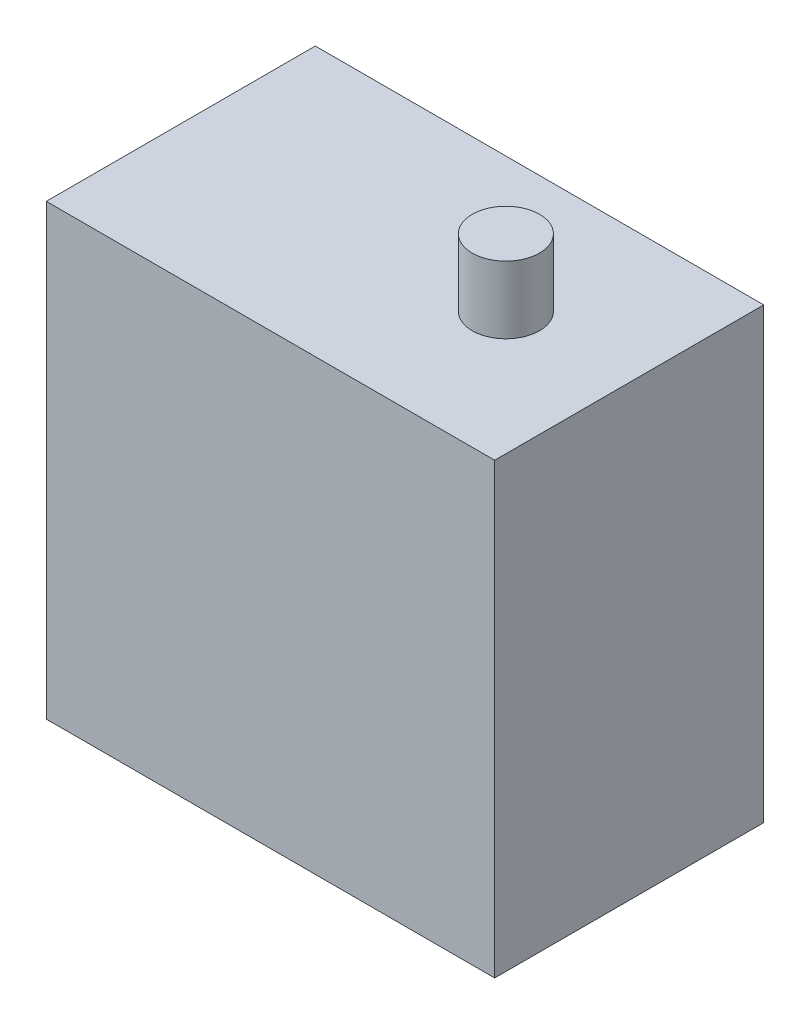
ISO-10303-21;
HEADER;
FILE_DESCRIPTION(('STEP AP214'),'2;1');
FILE_NAME('part.step','',(''),(''),'','','');
FILE_SCHEMA(('AUTOMOTIVE_DESIGN { 1 0 10303 214 1 1 1 1 }'));
ENDSEC;
DATA;
#1=APPLICATION_CONTEXT('core data for automotive mechanical design processes');
#2=APPLICATION_PROTOCOL_DEFINITION('international standard','automotive_design',2000,#1);
#3=PRODUCT_CONTEXT('',#1,'mechanical');
#4=PRODUCT('Part','Part','',(#3));
#5=PRODUCT_RELATED_PRODUCT_CATEGORY('part','',(#4));
#6=PRODUCT_DEFINITION_FORMATION('','',#4);
#7=PRODUCT_DEFINITION_CONTEXT('part definition',#1,'design');
#8=PRODUCT_DEFINITION('design','',#6,#7);
#9=PRODUCT_DEFINITION_SHAPE('','',#8);
#10=(LENGTH_UNIT() NAMED_UNIT(*) SI_UNIT(.MILLI.,.METRE.));
#11=(NAMED_UNIT(*) PLANE_ANGLE_UNIT() SI_UNIT($,.RADIAN.));
#12=(NAMED_UNIT(*) SI_UNIT($,.STERADIAN.) SOLID_ANGLE_UNIT());
#13=UNCERTAINTY_MEASURE_WITH_UNIT(LENGTH_MEASURE(1.E-05),#10,'distance_accuracy_value','');
#14=(GEOMETRIC_REPRESENTATION_CONTEXT(3) GLOBAL_UNCERTAINTY_ASSIGNED_CONTEXT((#13)) GLOBAL_UNIT_ASSIGNED_CONTEXT((#10,
#11,#12)) REPRESENTATION_CONTEXT('',''));
#15=CARTESIAN_POINT('',(0.,0.,0.));
#16=DIRECTION('',(0.,0.,1.));
#17=DIRECTION('',(1.,0.,0.));
#18=AXIS2_PLACEMENT_3D('',#15,#16,#17);
#19=CARTESIAN_POINT('',(10.,20.,-6.));
#20=DIRECTION('',(-1.,0.,0.));
#21=DIRECTION('',(0.,0.,1.));
#22=AXIS2_PLACEMENT_3D('',#19,#20,#21);
#23=PLANE('',#22);
#24=DIRECTION('',(0.,0.,-1.));
#25=VECTOR('',#24,1.);
#26=CARTESIAN_POINT('',(10.,0.,-6.));
#27=LINE('',#26,#25);
#28=CARTESIAN_POINT('',(10.,0.,6.));
#29=VERTEX_POINT('',#28);
#30=CARTESIAN_POINT('',(10.,0.,-6.));
#31=VERTEX_POINT('',#30);
#32=EDGE_CURVE('E96',#29,#31,#27,.T.);
#33=ORIENTED_EDGE('',*,*,#32,.T.);
#34=DIRECTION('',(0.,-1.,0.));
#35=VECTOR('',#34,1.);
#36=CARTESIAN_POINT('',(10.,20.,-6.));
#37=LINE('',#36,#35);
#38=CARTESIAN_POINT('',(10.,20.,-6.));
#39=VERTEX_POINT('',#38);
#40=EDGE_CURVE('E11',#39,#31,#37,.T.);
#41=ORIENTED_EDGE('',*,*,#40,.F.);
#42=DIRECTION('',(0.,0.,-1.));
#43=VECTOR('',#42,1.);
#44=CARTESIAN_POINT('',(10.,20.,-6.));
#45=LINE('',#44,#43);
#46=CARTESIAN_POINT('',(10.,20.,6.));
#47=VERTEX_POINT('',#46);
#48=EDGE_CURVE('E84',#47,#39,#45,.T.);
#49=ORIENTED_EDGE('',*,*,#48,.F.);
#50=DIRECTION('',(0.,-1.,0.));
#51=VECTOR('',#50,1.);
#52=CARTESIAN_POINT('',(10.,20.,6.));
#53=LINE('',#52,#51);
#54=EDGE_CURVE('E92',#47,#29,#53,.T.);
#55=ORIENTED_EDGE('',*,*,#54,.T.);
#56=EDGE_LOOP('',(#33,#41,#49,#55));
#57=FACE_BOUND('',#56,.T.);
#58=ADVANCED_FACE('F33',(#57),#23,.F.);
#59=CARTESIAN_POINT('',(-10.,20.,-6.));
#60=DIRECTION('',(0.,0.,1.));
#61=DIRECTION('',(1.,0.,0.));
#62=AXIS2_PLACEMENT_3D('',#59,#60,#61);
#63=PLANE('',#62);
#64=DIRECTION('',(-1.,0.,0.));
#65=VECTOR('',#64,1.);
#66=CARTESIAN_POINT('',(-10.,0.,-6.));
#67=LINE('',#66,#65);
#68=CARTESIAN_POINT('',(-10.,0.,-6.));
#69=VERTEX_POINT('',#68);
#70=EDGE_CURVE('E88',#31,#69,#67,.T.);
#71=ORIENTED_EDGE('',*,*,#70,.T.);
#72=DIRECTION('',(0.,-1.,0.));
#73=VECTOR('',#72,1.);
#74=CARTESIAN_POINT('',(-10.,20.,-6.));
#75=LINE('',#74,#73);
#76=CARTESIAN_POINT('',(-10.,20.,-6.));
#77=VERTEX_POINT('',#76);
#78=EDGE_CURVE('E41',#77,#69,#75,.T.);
#79=ORIENTED_EDGE('',*,*,#78,.F.);
#80=DIRECTION('',(-1.,0.,0.));
#81=VECTOR('',#80,1.);
#82=CARTESIAN_POINT('',(-10.,20.,-6.));
#83=LINE('',#82,#81);
#84=EDGE_CURVE('E79',#39,#77,#83,.T.);
#85=ORIENTED_EDGE('',*,*,#84,.F.);
#86=ORIENTED_EDGE('',*,*,#40,.T.);
#87=EDGE_LOOP('',(#71,#79,#85,#86));
#88=FACE_BOUND('',#87,.T.);
#89=ADVANCED_FACE('F87',(#88),#63,.F.);
#90=CARTESIAN_POINT('',(-10.,20.,-6.));
#91=DIRECTION('',(1.,0.,0.));
#92=DIRECTION('',(0.,0.,-1.));
#93=AXIS2_PLACEMENT_3D('',#90,#91,#92);
#94=PLANE('',#93);
#95=DIRECTION('',(0.,0.,1.));
#96=VECTOR('',#95,1.);
#97=CARTESIAN_POINT('',(-10.,0.,-6.));
#98=LINE('',#97,#96);
#99=CARTESIAN_POINT('',(-10.,0.,6.));
#100=VERTEX_POINT('',#99);
#101=EDGE_CURVE('E66',#69,#100,#98,.T.);
#102=ORIENTED_EDGE('',*,*,#101,.T.);
#103=DIRECTION('',(0.,-1.,0.));
#104=VECTOR('',#103,1.);
#105=CARTESIAN_POINT('',(-10.,20.,6.));
#106=LINE('',#105,#104);
#107=CARTESIAN_POINT('',(-10.,20.,6.));
#108=VERTEX_POINT('',#107);
#109=EDGE_CURVE('E89',#108,#100,#106,.T.);
#110=ORIENTED_EDGE('',*,*,#109,.F.);
#111=DIRECTION('',(0.,0.,1.));
#112=VECTOR('',#111,1.);
#113=CARTESIAN_POINT('',(-10.,20.,-6.));
#114=LINE('',#113,#112);
#115=EDGE_CURVE('E82',#77,#108,#114,.T.);
#116=ORIENTED_EDGE('',*,*,#115,.F.);
#117=ORIENTED_EDGE('',*,*,#78,.T.);
#118=EDGE_LOOP('',(#102,#110,#116,#117));
#119=FACE_BOUND('',#118,.T.);
#120=ADVANCED_FACE('F90',(#119),#94,.F.);
#121=CARTESIAN_POINT('',(-10.,20.,6.));
#122=DIRECTION('',(0.,0.,-1.));
#123=DIRECTION('',(-1.,0.,0.));
#124=AXIS2_PLACEMENT_3D('',#121,#122,#123);
#125=PLANE('',#124);
#126=DIRECTION('',(1.,0.,0.));
#127=VECTOR('',#126,1.);
#128=CARTESIAN_POINT('',(-10.,0.,6.));
#129=LINE('',#128,#127);
#130=EDGE_CURVE('E72',#100,#29,#129,.T.);
#131=ORIENTED_EDGE('',*,*,#130,.T.);
#132=ORIENTED_EDGE('',*,*,#54,.F.);
#133=DIRECTION('',(1.,0.,0.));
#134=VECTOR('',#133,1.);
#135=CARTESIAN_POINT('',(-10.,20.,6.));
#136=LINE('',#135,#134);
#137=EDGE_CURVE('E49',#108,#47,#136,.T.);
#138=ORIENTED_EDGE('',*,*,#137,.F.);
#139=ORIENTED_EDGE('',*,*,#109,.T.);
#140=EDGE_LOOP('',(#131,#132,#138,#139));
#141=FACE_BOUND('',#140,.T.);
#142=ADVANCED_FACE('F104',(#141),#125,.F.);
#143=CARTESIAN_POINT('',(0.,20.,0.));
#144=DIRECTION('',(0.,1.,0.));
#145=DIRECTION('',(0.,0.,1.));
#146=AXIS2_PLACEMENT_3D('',#143,#144,#145);
#147=PLANE('',#146);
#148=CARTESIAN_POINT('',(4.5,20.,0.));
#149=DIRECTION('',(0.,1.,0.));
#150=DIRECTION('',(0.,0.,1.));
#151=AXIS2_PLACEMENT_3D('',#148,#149,#150);
#152=CIRCLE('',#151,1.5);
#153=CARTESIAN_POINT('',(4.5,20.,1.5));
#154=VERTEX_POINT('',#153);
#155=EDGE_CURVE('E110',#154,#154,#152,.T.);
#156=ORIENTED_EDGE('',*,*,#155,.F.);
#157=EDGE_LOOP('',(#156));
#158=FACE_BOUND('',#157,.T.);
#159=ORIENTED_EDGE('',*,*,#48,.T.);
#160=ORIENTED_EDGE('',*,*,#84,.T.);
#161=ORIENTED_EDGE('',*,*,#115,.T.);
#162=ORIENTED_EDGE('',*,*,#137,.T.);
#163=EDGE_LOOP('',(#159,#160,#161,#162));
#164=FACE_BOUND('',#163,.T.);
#165=ADVANCED_FACE('F80',(#158,#164),#147,.T.);
#166=CARTESIAN_POINT('',(0.,0.,0.));
#167=DIRECTION('',(0.,1.,0.));
#168=DIRECTION('',(0.,0.,1.));
#169=AXIS2_PLACEMENT_3D('',#166,#167,#168);
#170=PLANE('',#169);
#171=ORIENTED_EDGE('',*,*,#32,.F.);
#172=ORIENTED_EDGE('',*,*,#130,.F.);
#173=ORIENTED_EDGE('',*,*,#101,.F.);
#174=ORIENTED_EDGE('',*,*,#70,.F.);
#175=EDGE_LOOP('',(#171,#172,#173,#174));
#176=FACE_BOUND('',#175,.T.);
#177=ADVANCED_FACE('F107',(#176),#170,.F.);
#178=CARTESIAN_POINT('',(4.5,23.,0.));
#179=DIRECTION('',(0.,-1.,0.));
#180=DIRECTION('',(0.,0.,-1.));
#181=AXIS2_PLACEMENT_3D('',#178,#179,#180);
#182=CYLINDRICAL_SURFACE('',#181,1.5);
#183=CARTESIAN_POINT('',(4.5,23.,0.));
#184=DIRECTION('',(0.,1.,0.));
#185=DIRECTION('',(0.,0.,1.));
#186=AXIS2_PLACEMENT_3D('',#183,#184,#185);
#187=CIRCLE('',#186,1.5);
#188=CARTESIAN_POINT('',(4.5,23.,1.5));
#189=VERTEX_POINT('',#188);
#190=EDGE_CURVE('E99',#189,#189,#187,.T.);
#191=ORIENTED_EDGE('',*,*,#190,.F.);
#192=EDGE_LOOP('',(#191));
#193=FACE_BOUND('',#192,.T.);
#194=ORIENTED_EDGE('',*,*,#155,.T.);
#195=EDGE_LOOP('',(#194));
#196=FACE_BOUND('',#195,.T.);
#197=ADVANCED_FACE('F118',(#193,#196),#182,.T.);
#198=CARTESIAN_POINT('',(4.5,23.,0.));
#199=DIRECTION('',(0.,1.,0.));
#200=DIRECTION('',(0.,0.,1.));
#201=AXIS2_PLACEMENT_3D('',#198,#199,#200);
#202=PLANE('',#201);
#203=ORIENTED_EDGE('',*,*,#190,.T.);
#204=EDGE_LOOP('',(#203));
#205=FACE_BOUND('',#204,.T.);
#206=ADVANCED_FACE('F116',(#205),#202,.T.);
#207=CLOSED_SHELL('',(#58,#89,#120,#142,#165,#177,#197,#206));
#208=MANIFOLD_SOLID_BREP('B2',#207);
#209=ADVANCED_BREP_SHAPE_REPRESENTATION('',(#18,#208),#14);
#210=SHAPE_DEFINITION_REPRESENTATION(#9,#209);
ENDSEC;
END-ISO-10303-21;
